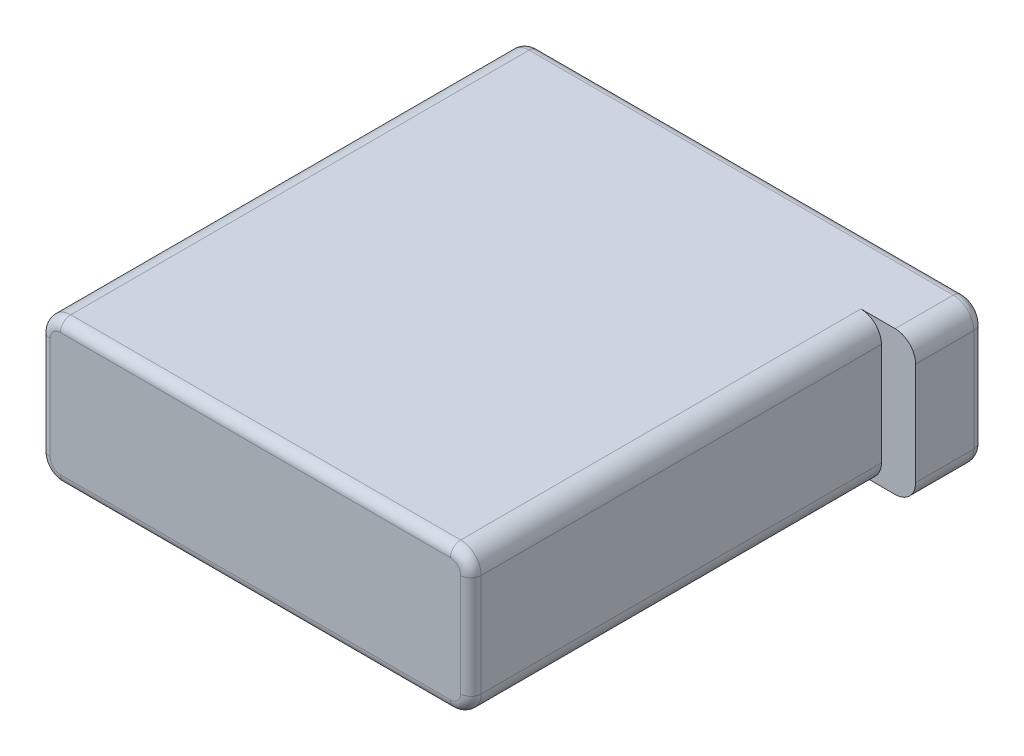
ISO-10303-21;
HEADER;
FILE_DESCRIPTION(('STEP AP214'),'2;1');
FILE_NAME('part.step','',(''),(''),'','','');
FILE_SCHEMA(('AUTOMOTIVE_DESIGN { 1 0 10303 214 1 1 1 1 }'));
ENDSEC;
DATA;
#1=APPLICATION_CONTEXT('core data for automotive mechanical design processes');
#2=APPLICATION_PROTOCOL_DEFINITION('international standard','automotive_design',2000,#1);
#3=PRODUCT_CONTEXT('',#1,'mechanical');
#4=PRODUCT('Part','Part','',(#3));
#5=PRODUCT_RELATED_PRODUCT_CATEGORY('part','',(#4));
#6=PRODUCT_DEFINITION_FORMATION('','',#4);
#7=PRODUCT_DEFINITION_CONTEXT('part definition',#1,'design');
#8=PRODUCT_DEFINITION('design','',#6,#7);
#9=PRODUCT_DEFINITION_SHAPE('','',#8);
#10=(LENGTH_UNIT() NAMED_UNIT(*) SI_UNIT(.MILLI.,.METRE.));
#11=(NAMED_UNIT(*) PLANE_ANGLE_UNIT() SI_UNIT($,.RADIAN.));
#12=(NAMED_UNIT(*) SI_UNIT($,.STERADIAN.) SOLID_ANGLE_UNIT());
#13=UNCERTAINTY_MEASURE_WITH_UNIT(LENGTH_MEASURE(1.E-05),#10,'distance_accuracy_value','');
#14=(GEOMETRIC_REPRESENTATION_CONTEXT(3) GLOBAL_UNCERTAINTY_ASSIGNED_CONTEXT((#13)) GLOBAL_UNIT_ASSIGNED_CONTEXT((#10,
#11,#12)) REPRESENTATION_CONTEXT('',''));
#15=CARTESIAN_POINT('',(0.,0.,0.));
#16=DIRECTION('',(0.,0.,1.));
#17=DIRECTION('',(1.,0.,0.));
#18=AXIS2_PLACEMENT_3D('',#15,#16,#17);
#19=CARTESIAN_POINT('',(-31.5,21.,-35.));
#20=DIRECTION('',(1.,0.,0.));
#21=DIRECTION('',(0.,0.,-1.));
#22=AXIS2_PLACEMENT_3D('',#19,#20,#21);
#23=PLANE('',#22);
#24=DIRECTION('',(0.,0.,1.));
#25=VECTOR('',#24,1.);
#26=CARTESIAN_POINT('',(-31.5,3.,-35.));
#27=LINE('',#26,#25);
#28=CARTESIAN_POINT('',(-31.5,3.,-33.5));
#29=VERTEX_POINT('',#28);
#30=CARTESIAN_POINT('',(-31.5,3.,33.5));
#31=VERTEX_POINT('',#30);
#32=EDGE_CURVE('E414',#29,#31,#27,.T.);
#33=ORIENTED_EDGE('',*,*,#32,.T.);
#34=DIRECTION('',(0.,-1.,0.));
#35=VECTOR('',#34,1.);
#36=CARTESIAN_POINT('',(-31.5,21.,33.5));
#37=LINE('',#36,#35);
#38=CARTESIAN_POINT('',(-31.5,18.,33.5));
#39=VERTEX_POINT('',#38);
#40=EDGE_CURVE('E298',#31,#39,#37,.F.);
#41=ORIENTED_EDGE('',*,*,#40,.T.);
#42=DIRECTION('',(0.,0.,1.));
#43=VECTOR('',#42,1.);
#44=CARTESIAN_POINT('',(-31.5,18.,-35.));
#45=LINE('',#44,#43);
#46=CARTESIAN_POINT('',(-31.5,18.,-33.5));
#47=VERTEX_POINT('',#46);
#48=EDGE_CURVE('E405',#39,#47,#45,.F.);
#49=ORIENTED_EDGE('',*,*,#48,.T.);
#50=DIRECTION('',(0.,-1.,0.));
#51=VECTOR('',#50,1.);
#52=CARTESIAN_POINT('',(-31.5,3.00000000000001,-33.5));
#53=LINE('',#52,#51);
#54=EDGE_CURVE('E295',#47,#29,#53,.T.);
#55=ORIENTED_EDGE('',*,*,#54,.T.);
#56=EDGE_LOOP('',(#33,#41,#49,#55));
#57=FACE_BOUND('',#56,.T.);
#58=ADVANCED_FACE('F47',(#57),#23,.F.);
#59=CARTESIAN_POINT('',(-31.5,21.,35.));
#60=DIRECTION('',(0.,0.,-1.));
#61=DIRECTION('',(-1.,0.,0.));
#62=AXIS2_PLACEMENT_3D('',#59,#60,#61);
#63=PLANE('',#62);
#64=DIRECTION('',(1.,0.,0.));
#65=VECTOR('',#64,1.);
#66=CARTESIAN_POINT('',(-28.5,19.5,35.));
#67=LINE('',#66,#65);
#68=CARTESIAN_POINT('',(28.5,19.5,35.));
#69=VERTEX_POINT('',#68);
#70=CARTESIAN_POINT('',(-28.5,19.5,35.));
#71=VERTEX_POINT('',#70);
#72=EDGE_CURVE('E255',#69,#71,#67,.F.);
#73=ORIENTED_EDGE('',*,*,#72,.T.);
#74=CARTESIAN_POINT('',(-28.5,18.,35.));
#75=DIRECTION('',(0.,0.,-1.));
#76=DIRECTION('',(-1.,0.,0.));
#77=AXIS2_PLACEMENT_3D('',#74,#75,#76);
#78=CIRCLE('',#77,1.5);
#79=CARTESIAN_POINT('',(-30.,18.,35.));
#80=VERTEX_POINT('',#79);
#81=EDGE_CURVE('E258',#71,#80,#78,.F.);
#82=ORIENTED_EDGE('',*,*,#81,.T.);
#83=DIRECTION('',(0.,-1.,0.));
#84=VECTOR('',#83,1.);
#85=CARTESIAN_POINT('',(-30.,21.,35.));
#86=LINE('',#85,#84);
#87=CARTESIAN_POINT('',(-30.,3.,35.));
#88=VERTEX_POINT('',#87);
#89=EDGE_CURVE('E237',#80,#88,#86,.T.);
#90=ORIENTED_EDGE('',*,*,#89,.T.);
#91=CARTESIAN_POINT('',(-28.5,3.,35.));
#92=DIRECTION('',(0.,0.,-1.));
#93=DIRECTION('',(-1.,0.,0.));
#94=AXIS2_PLACEMENT_3D('',#91,#92,#93);
#95=CIRCLE('',#94,1.5);
#96=CARTESIAN_POINT('',(-28.5,1.5,35.));
#97=VERTEX_POINT('',#96);
#98=EDGE_CURVE('E240',#88,#97,#95,.F.);
#99=ORIENTED_EDGE('',*,*,#98,.T.);
#100=DIRECTION('',(1.,0.,0.));
#101=VECTOR('',#100,1.);
#102=CARTESIAN_POINT('',(-31.5,1.5,35.));
#103=LINE('',#102,#101);
#104=CARTESIAN_POINT('',(28.5,1.5,35.));
#105=VERTEX_POINT('',#104);
#106=EDGE_CURVE('E243',#97,#105,#103,.T.);
#107=ORIENTED_EDGE('',*,*,#106,.T.);
#108=CARTESIAN_POINT('',(28.5,3.,35.));
#109=DIRECTION('',(0.,0.,-1.));
#110=DIRECTION('',(-1.,0.,0.));
#111=AXIS2_PLACEMENT_3D('',#108,#109,#110);
#112=CIRCLE('',#111,1.5);
#113=CARTESIAN_POINT('',(30.,3.,35.));
#114=VERTEX_POINT('',#113);
#115=EDGE_CURVE('E246',#105,#114,#112,.F.);
#116=ORIENTED_EDGE('',*,*,#115,.T.);
#117=DIRECTION('',(0.,-1.,0.));
#118=VECTOR('',#117,1.);
#119=CARTESIAN_POINT('',(30.,18.,35.));
#120=LINE('',#119,#118);
#121=CARTESIAN_POINT('',(30.,18.,35.));
#122=VERTEX_POINT('',#121);
#123=EDGE_CURVE('E249',#114,#122,#120,.F.);
#124=ORIENTED_EDGE('',*,*,#123,.T.);
#125=CARTESIAN_POINT('',(28.5,18.,35.));
#126=DIRECTION('',(0.,0.,-1.));
#127=DIRECTION('',(-1.,0.,0.));
#128=AXIS2_PLACEMENT_3D('',#125,#126,#127);
#129=CIRCLE('',#128,1.5);
#130=EDGE_CURVE('E252',#122,#69,#129,.F.);
#131=ORIENTED_EDGE('',*,*,#130,.T.);
#132=EDGE_LOOP('',(#73,#82,#90,#99,#107,#116,#124,#131));
#133=FACE_BOUND('',#132,.T.);
#134=ADVANCED_FACE('F513',(#133),#63,.F.);
#135=CARTESIAN_POINT('',(31.5,21.,-35.));
#136=DIRECTION('',(1.,0.,0.));
#137=DIRECTION('',(0.,0.,-1.));
#138=AXIS2_PLACEMENT_3D('',#135,#136,#137);
#139=PLANE('',#138);
#140=DIRECTION('',(0.,0.,1.));
#141=VECTOR('',#140,1.);
#142=CARTESIAN_POINT('',(31.5,18.,-35.));
#143=LINE('',#142,#141);
#144=CARTESIAN_POINT('',(31.5,18.,-25.));
#145=VERTEX_POINT('',#144);
#146=CARTESIAN_POINT('',(31.5,18.,33.5));
#147=VERTEX_POINT('',#146);
#148=EDGE_CURVE('E219',#145,#147,#143,.T.);
#149=ORIENTED_EDGE('',*,*,#148,.T.);
#150=DIRECTION('',(0.,-1.,0.));
#151=VECTOR('',#150,1.);
#152=CARTESIAN_POINT('',(31.5,3.00000000000001,33.5));
#153=LINE('',#152,#151);
#154=CARTESIAN_POINT('',(31.5,3.,33.5));
#155=VERTEX_POINT('',#154);
#156=EDGE_CURVE('E278',#147,#155,#153,.T.);
#157=ORIENTED_EDGE('',*,*,#156,.T.);
#158=DIRECTION('',(0.,0.,1.));
#159=VECTOR('',#158,1.);
#160=CARTESIAN_POINT('',(31.5,3.,-25.));
#161=LINE('',#160,#159);
#162=CARTESIAN_POINT('',(31.5,3.,-25.));
#163=VERTEX_POINT('',#162);
#164=EDGE_CURVE('E225',#155,#163,#161,.F.);
#165=ORIENTED_EDGE('',*,*,#164,.T.);
#166=DIRECTION('',(0.,-1.,0.));
#167=VECTOR('',#166,1.);
#168=CARTESIAN_POINT('',(31.5,0.,-25.));
#169=LINE('',#168,#167);
#170=EDGE_CURVE('E361',#145,#163,#169,.T.);
#171=ORIENTED_EDGE('',*,*,#170,.F.);
#172=EDGE_LOOP('',(#149,#157,#165,#171));
#173=FACE_BOUND('',#172,.T.);
#174=ADVANCED_FACE('F502',(#173),#139,.T.);
#175=CARTESIAN_POINT('',(-31.5,21.,-35.));
#176=DIRECTION('',(0.,0.,-1.));
#177=DIRECTION('',(-1.,0.,0.));
#178=AXIS2_PLACEMENT_3D('',#175,#176,#177);
#179=PLANE('',#178);
#180=DIRECTION('',(0.,1.,0.));
#181=VECTOR('',#180,1.);
#182=CARTESIAN_POINT('',(35.,21.,-35.));
#183=LINE('',#182,#181);
#184=CARTESIAN_POINT('',(35.,18.,-35.));
#185=VERTEX_POINT('',#184);
#186=CARTESIAN_POINT('',(35.,3.,-35.));
#187=VERTEX_POINT('',#186);
#188=EDGE_CURVE('E319',#185,#187,#183,.F.);
#189=ORIENTED_EDGE('',*,*,#188,.T.);
#190=CARTESIAN_POINT('',(33.5,3.,-35.));
#191=DIRECTION('',(0.,0.,-1.));
#192=DIRECTION('',(-1.,0.,0.));
#193=AXIS2_PLACEMENT_3D('',#190,#191,#192);
#194=CIRCLE('',#193,1.5);
#195=CARTESIAN_POINT('',(33.5,1.5,-35.));
#196=VERTEX_POINT('',#195);
#197=EDGE_CURVE('E322',#187,#196,#194,.T.);
#198=ORIENTED_EDGE('',*,*,#197,.T.);
#199=DIRECTION('',(1.,0.,0.));
#200=VECTOR('',#199,1.);
#201=CARTESIAN_POINT('',(-28.5,1.5,-35.));
#202=LINE('',#201,#200);
#203=CARTESIAN_POINT('',(-28.5,1.5,-35.));
#204=VERTEX_POINT('',#203);
#205=EDGE_CURVE('E301',#196,#204,#202,.F.);
#206=ORIENTED_EDGE('',*,*,#205,.T.);
#207=CARTESIAN_POINT('',(-28.5,3.,-35.));
#208=DIRECTION('',(0.,0.,-1.));
#209=DIRECTION('',(-1.,0.,0.));
#210=AXIS2_PLACEMENT_3D('',#207,#208,#209);
#211=CIRCLE('',#210,1.5);
#212=CARTESIAN_POINT('',(-30.,3.,-35.));
#213=VERTEX_POINT('',#212);
#214=EDGE_CURVE('E304',#204,#213,#211,.T.);
#215=ORIENTED_EDGE('',*,*,#214,.T.);
#216=DIRECTION('',(0.,-1.,0.));
#217=VECTOR('',#216,1.);
#218=CARTESIAN_POINT('',(-30.,18.,-35.));
#219=LINE('',#218,#217);
#220=CARTESIAN_POINT('',(-30.,18.,-35.));
#221=VERTEX_POINT('',#220);
#222=EDGE_CURVE('E307',#213,#221,#219,.F.);
#223=ORIENTED_EDGE('',*,*,#222,.T.);
#224=CARTESIAN_POINT('',(-28.5,18.,-35.));
#225=DIRECTION('',(0.,0.,-1.));
#226=DIRECTION('',(-1.,0.,0.));
#227=AXIS2_PLACEMENT_3D('',#224,#225,#226);
#228=CIRCLE('',#227,1.5);
#229=CARTESIAN_POINT('',(-28.5,19.5,-35.));
#230=VERTEX_POINT('',#229);
#231=EDGE_CURVE('E310',#221,#230,#228,.T.);
#232=ORIENTED_EDGE('',*,*,#231,.T.);
#233=DIRECTION('',(1.,0.,0.));
#234=VECTOR('',#233,1.);
#235=CARTESIAN_POINT('',(-31.5,19.5,-35.));
#236=LINE('',#235,#234);
#237=CARTESIAN_POINT('',(33.5,19.5,-35.));
#238=VERTEX_POINT('',#237);
#239=EDGE_CURVE('E313',#230,#238,#236,.T.);
#240=ORIENTED_EDGE('',*,*,#239,.T.);
#241=CARTESIAN_POINT('',(33.5,18.,-35.));
#242=DIRECTION('',(0.,0.,-1.));
#243=DIRECTION('',(-1.,0.,0.));
#244=AXIS2_PLACEMENT_3D('',#241,#242,#243);
#245=CIRCLE('',#244,1.5);
#246=EDGE_CURVE('E316',#238,#185,#245,.T.);
#247=ORIENTED_EDGE('',*,*,#246,.T.);
#248=EDGE_LOOP('',(#189,#198,#206,#215,#223,#232,#240,#247));
#249=FACE_BOUND('',#248,.T.);
#250=ADVANCED_FACE('F482',(#249),#179,.T.);
#251=CARTESIAN_POINT('',(0.,21.,0.));
#252=DIRECTION('',(0.,1.,0.));
#253=DIRECTION('',(0.,0.,1.));
#254=AXIS2_PLACEMENT_3D('',#251,#252,#253);
#255=PLANE('',#254);
#256=DIRECTION('',(0.,0.,1.));
#257=VECTOR('',#256,1.);
#258=CARTESIAN_POINT('',(-28.5,21.,35.));
#259=LINE('',#258,#257);
#260=CARTESIAN_POINT('',(-28.5,21.,-33.5));
#261=VERTEX_POINT('',#260);
#262=CARTESIAN_POINT('',(-28.5,21.,33.5));
#263=VERTEX_POINT('',#262);
#264=EDGE_CURVE('E408',#261,#263,#259,.T.);
#265=ORIENTED_EDGE('',*,*,#264,.T.);
#266=DIRECTION('',(1.,0.,0.));
#267=VECTOR('',#266,1.);
#268=CARTESIAN_POINT('',(28.5,21.,33.5));
#269=LINE('',#268,#267);
#270=CARTESIAN_POINT('',(28.5,21.,33.5));
#271=VERTEX_POINT('',#270);
#272=EDGE_CURVE('E272',#263,#271,#269,.T.);
#273=ORIENTED_EDGE('',*,*,#272,.T.);
#274=DIRECTION('',(0.,0.,1.));
#275=VECTOR('',#274,1.);
#276=CARTESIAN_POINT('',(28.5,21.,0.));
#277=LINE('',#276,#275);
#278=CARTESIAN_POINT('',(28.5,21.,-25.));
#279=VERTEX_POINT('',#278);
#280=EDGE_CURVE('E426',#271,#279,#277,.F.);
#281=ORIENTED_EDGE('',*,*,#280,.T.);
#282=DIRECTION('',(-1.,0.,0.));
#283=VECTOR('',#282,1.);
#284=CARTESIAN_POINT('',(36.5,21.,-25.));
#285=LINE('',#284,#283);
#286=CARTESIAN_POINT('',(33.5,21.,-25.));
#287=VERTEX_POINT('',#286);
#288=EDGE_CURVE('E212',#287,#279,#285,.T.);
#289=ORIENTED_EDGE('',*,*,#288,.F.);
#290=DIRECTION('',(0.,0.,1.));
#291=VECTOR('',#290,1.);
#292=CARTESIAN_POINT('',(33.5,21.,0.));
#293=LINE('',#292,#291);
#294=CARTESIAN_POINT('',(33.5,21.,-33.5));
#295=VERTEX_POINT('',#294);
#296=EDGE_CURVE('E429',#287,#295,#293,.F.);
#297=ORIENTED_EDGE('',*,*,#296,.T.);
#298=DIRECTION('',(1.,0.,0.));
#299=VECTOR('',#298,1.);
#300=CARTESIAN_POINT('',(0.,21.,-33.5));
#301=LINE('',#300,#299);
#302=EDGE_CURVE('E269',#295,#261,#301,.F.);
#303=ORIENTED_EDGE('',*,*,#302,.T.);
#304=EDGE_LOOP('',(#265,#273,#281,#289,#297,#303));
#305=FACE_BOUND('',#304,.T.);
#306=ADVANCED_FACE('F496',(#305),#255,.T.);
#307=CARTESIAN_POINT('',(0.,0.,0.));
#308=DIRECTION('',(0.,1.,0.));
#309=DIRECTION('',(0.,0.,1.));
#310=AXIS2_PLACEMENT_3D('',#307,#308,#309);
#311=PLANE('',#310);
#312=DIRECTION('',(0.,0.,1.));
#313=VECTOR('',#312,1.);
#314=CARTESIAN_POINT('',(28.5,0.,35.));
#315=LINE('',#314,#313);
#316=CARTESIAN_POINT('',(28.5,0.,-25.));
#317=VERTEX_POINT('',#316);
#318=CARTESIAN_POINT('',(28.5,0.,33.5));
#319=VERTEX_POINT('',#318);
#320=EDGE_CURVE('E200',#317,#319,#315,.T.);
#321=ORIENTED_EDGE('',*,*,#320,.T.);
#322=DIRECTION('',(1.,0.,0.));
#323=VECTOR('',#322,1.);
#324=CARTESIAN_POINT('',(0.,0.,33.5));
#325=LINE('',#324,#323);
#326=CARTESIAN_POINT('',(-28.5,0.,33.5));
#327=VERTEX_POINT('',#326);
#328=EDGE_CURVE('E286',#319,#327,#325,.F.);
#329=ORIENTED_EDGE('',*,*,#328,.T.);
#330=DIRECTION('',(0.,0.,1.));
#331=VECTOR('',#330,1.);
#332=CARTESIAN_POINT('',(-28.5,0.,0.));
#333=LINE('',#332,#331);
#334=CARTESIAN_POINT('',(-28.5,0.,-33.5));
#335=VERTEX_POINT('',#334);
#336=EDGE_CURVE('E199',#327,#335,#333,.F.);
#337=ORIENTED_EDGE('',*,*,#336,.T.);
#338=DIRECTION('',(1.,0.,0.));
#339=VECTOR('',#338,1.);
#340=CARTESIAN_POINT('',(33.5,0.,-33.5));
#341=LINE('',#340,#339);
#342=CARTESIAN_POINT('',(33.5,0.,-33.5));
#343=VERTEX_POINT('',#342);
#344=EDGE_CURVE('E194',#335,#343,#341,.T.);
#345=ORIENTED_EDGE('',*,*,#344,.T.);
#346=DIRECTION('',(0.,0.,-1.));
#347=VECTOR('',#346,1.);
#348=CARTESIAN_POINT('',(33.5,0.,-25.));
#349=LINE('',#348,#347);
#350=CARTESIAN_POINT('',(33.5,0.,-25.));
#351=VERTEX_POINT('',#350);
#352=EDGE_CURVE('E186',#343,#351,#349,.F.);
#353=ORIENTED_EDGE('',*,*,#352,.T.);
#354=DIRECTION('',(-1.,0.,0.));
#355=VECTOR('',#354,1.);
#356=CARTESIAN_POINT('',(36.5,0.,-25.));
#357=LINE('',#356,#355);
#358=EDGE_CURVE('E190',#351,#317,#357,.T.);
#359=ORIENTED_EDGE('',*,*,#358,.T.);
#360=EDGE_LOOP('',(#321,#329,#337,#345,#353,#359));
#361=FACE_BOUND('',#360,.T.);
#362=ADVANCED_FACE('F189',(#361),#311,.F.);
#363=CARTESIAN_POINT('',(36.5,0.,-25.));
#364=DIRECTION('',(0.,0.,-1.));
#365=DIRECTION('',(-1.,0.,0.));
#366=AXIS2_PLACEMENT_3D('',#363,#364,#365);
#367=PLANE('',#366);
#368=ORIENTED_EDGE('',*,*,#358,.F.);
#369=CARTESIAN_POINT('',(33.5,3.,-25.));
#370=DIRECTION('',(0.,0.,-1.));
#371=DIRECTION('',(-1.,0.,0.));
#372=AXIS2_PLACEMENT_3D('',#369,#370,#371);
#373=CIRCLE('',#372,3.);
#374=CARTESIAN_POINT('',(36.5,3.,-25.));
#375=VERTEX_POINT('',#374);
#376=EDGE_CURVE('E205',#351,#375,#373,.F.);
#377=ORIENTED_EDGE('',*,*,#376,.T.);
#378=DIRECTION('',(0.,-1.,0.));
#379=VECTOR('',#378,1.);
#380=CARTESIAN_POINT('',(36.5,0.,-25.));
#381=LINE('',#380,#379);
#382=CARTESIAN_POINT('',(36.5,18.,-25.));
#383=VERTEX_POINT('',#382);
#384=EDGE_CURVE('E213',#383,#375,#381,.T.);
#385=ORIENTED_EDGE('',*,*,#384,.F.);
#386=CARTESIAN_POINT('',(33.5,18.,-25.));
#387=DIRECTION('',(0.,0.,-1.));
#388=DIRECTION('',(-1.,0.,0.));
#389=AXIS2_PLACEMENT_3D('',#386,#387,#388);
#390=CIRCLE('',#389,3.);
#391=EDGE_CURVE('E220',#383,#287,#390,.F.);
#392=ORIENTED_EDGE('',*,*,#391,.T.);
#393=ORIENTED_EDGE('',*,*,#288,.T.);
#394=CARTESIAN_POINT('',(28.5,18.,-25.));
#395=DIRECTION('',(0.,0.,-1.));
#396=DIRECTION('',(-1.,0.,0.));
#397=AXIS2_PLACEMENT_3D('',#394,#395,#396);
#398=CIRCLE('',#397,3.);
#399=EDGE_CURVE('E234',#279,#145,#398,.T.);
#400=ORIENTED_EDGE('',*,*,#399,.T.);
#401=ORIENTED_EDGE('',*,*,#170,.T.);
#402=CARTESIAN_POINT('',(28.5,3.,-25.));
#403=DIRECTION('',(0.,0.,-1.));
#404=DIRECTION('',(-1.,0.,0.));
#405=AXIS2_PLACEMENT_3D('',#402,#403,#404);
#406=CIRCLE('',#405,3.);
#407=EDGE_CURVE('E209',#163,#317,#406,.T.);
#408=ORIENTED_EDGE('',*,*,#407,.T.);
#409=EDGE_LOOP('',(#368,#377,#385,#392,#393,#400,#401,#408));
#410=FACE_BOUND('',#409,.T.);
#411=ADVANCED_FACE('F203',(#410),#367,.F.);
#412=CARTESIAN_POINT('',(36.5,0.,0.));
#413=DIRECTION('',(1.,0.,0.));
#414=DIRECTION('',(0.,0.,-1.));
#415=AXIS2_PLACEMENT_3D('',#412,#413,#414);
#416=PLANE('',#415);
#417=DIRECTION('',(0.,0.,-1.));
#418=VECTOR('',#417,1.);
#419=CARTESIAN_POINT('',(36.5,3.,-35.));
#420=LINE('',#419,#418);
#421=CARTESIAN_POINT('',(36.5,3.,-33.5));
#422=VERTEX_POINT('',#421);
#423=EDGE_CURVE('E217',#375,#422,#420,.T.);
#424=ORIENTED_EDGE('',*,*,#423,.T.);
#425=DIRECTION('',(0.,1.,0.));
#426=VECTOR('',#425,1.);
#427=CARTESIAN_POINT('',(36.5,0.,-33.5));
#428=LINE('',#427,#426);
#429=CARTESIAN_POINT('',(36.5,18.,-33.5));
#430=VERTEX_POINT('',#429);
#431=EDGE_CURVE('E57',#422,#430,#428,.T.);
#432=ORIENTED_EDGE('',*,*,#431,.T.);
#433=DIRECTION('',(0.,0.,1.));
#434=VECTOR('',#433,1.);
#435=CARTESIAN_POINT('',(36.5,18.,0.));
#436=LINE('',#435,#434);
#437=EDGE_CURVE('E435',#430,#383,#436,.T.);
#438=ORIENTED_EDGE('',*,*,#437,.T.);
#439=ORIENTED_EDGE('',*,*,#384,.T.);
#440=EDGE_LOOP('',(#424,#432,#438,#439));
#441=FACE_BOUND('',#440,.T.);
#442=ADVANCED_FACE('F438',(#441),#416,.T.);
#443=CARTESIAN_POINT('',(-28.5,3.,-35.));
#444=DIRECTION('',(0.,0.,1.));
#445=DIRECTION('',(1.,0.,0.));
#446=AXIS2_PLACEMENT_3D('',#443,#444,#445);
#447=CYLINDRICAL_SURFACE('',#446,3.);
#448=ORIENTED_EDGE('',*,*,#336,.F.);
#449=CARTESIAN_POINT('',(-28.5,3.,33.5));
#450=DIRECTION('',(0.,0.,-1.));
#451=DIRECTION('',(-1.,0.,0.));
#452=AXIS2_PLACEMENT_3D('',#449,#450,#451);
#453=CIRCLE('',#452,3.);
#454=EDGE_CURVE('E292',#327,#31,#453,.T.);
#455=ORIENTED_EDGE('',*,*,#454,.T.);
#456=ORIENTED_EDGE('',*,*,#32,.F.);
#457=CARTESIAN_POINT('',(-28.5,3.,-33.5));
#458=DIRECTION('',(0.,0.,-1.));
#459=DIRECTION('',(-1.,0.,0.));
#460=AXIS2_PLACEMENT_3D('',#457,#458,#459);
#461=CIRCLE('',#460,3.);
#462=EDGE_CURVE('E289',#29,#335,#461,.F.);
#463=ORIENTED_EDGE('',*,*,#462,.T.);
#464=EDGE_LOOP('',(#448,#455,#456,#463));
#465=FACE_BOUND('',#464,.T.);
#466=ADVANCED_FACE('F469',(#465),#447,.T.);
#467=CARTESIAN_POINT('',(-28.5,18.,0.));
#468=DIRECTION('',(0.,0.,-1.));
#469=DIRECTION('',(-1.,0.,0.));
#470=AXIS2_PLACEMENT_3D('',#467,#468,#469);
#471=CYLINDRICAL_SURFACE('',#470,3.);
#472=ORIENTED_EDGE('',*,*,#48,.F.);
#473=CARTESIAN_POINT('',(-28.5,18.,33.5));
#474=DIRECTION('',(0.,0.,-1.));
#475=DIRECTION('',(-1.,0.,0.));
#476=AXIS2_PLACEMENT_3D('',#473,#474,#475);
#477=CIRCLE('',#476,3.);
#478=EDGE_CURVE('E265',#39,#263,#477,.T.);
#479=ORIENTED_EDGE('',*,*,#478,.T.);
#480=ORIENTED_EDGE('',*,*,#264,.F.);
#481=CARTESIAN_POINT('',(-28.5,18.,-33.5));
#482=DIRECTION('',(0.,0.,-1.));
#483=DIRECTION('',(-1.,0.,0.));
#484=AXIS2_PLACEMENT_3D('',#481,#482,#483);
#485=CIRCLE('',#484,3.);
#486=EDGE_CURVE('E262',#261,#47,#485,.F.);
#487=ORIENTED_EDGE('',*,*,#486,.T.);
#488=EDGE_LOOP('',(#472,#479,#480,#487));
#489=FACE_BOUND('',#488,.T.);
#490=ADVANCED_FACE('F404',(#489),#471,.T.);
#491=CARTESIAN_POINT('',(33.5,3.,0.));
#492=DIRECTION('',(0.,0.,1.));
#493=DIRECTION('',(1.,0.,0.));
#494=AXIS2_PLACEMENT_3D('',#491,#492,#493);
#495=CYLINDRICAL_SURFACE('',#494,3.);
#496=ORIENTED_EDGE('',*,*,#352,.F.);
#497=CARTESIAN_POINT('',(33.5,3.,-33.5));
#498=DIRECTION('',(0.,0.,-1.));
#499=DIRECTION('',(-1.,0.,0.));
#500=AXIS2_PLACEMENT_3D('',#497,#498,#499);
#501=CIRCLE('',#500,3.);
#502=EDGE_CURVE('E326',#343,#422,#501,.F.);
#503=ORIENTED_EDGE('',*,*,#502,.T.);
#504=ORIENTED_EDGE('',*,*,#423,.F.);
#505=ORIENTED_EDGE('',*,*,#376,.F.);
#506=EDGE_LOOP('',(#496,#503,#504,#505));
#507=FACE_BOUND('',#506,.T.);
#508=ADVANCED_FACE('F216',(#507),#495,.T.);
#509=CARTESIAN_POINT('',(33.5,18.,0.));
#510=DIRECTION('',(0.,0.,1.));
#511=DIRECTION('',(1.,0.,0.));
#512=AXIS2_PLACEMENT_3D('',#509,#510,#511);
#513=CYLINDRICAL_SURFACE('',#512,3.);
#514=ORIENTED_EDGE('',*,*,#437,.F.);
#515=CARTESIAN_POINT('',(33.5,18.,-33.5));
#516=DIRECTION('',(0.,0.,-1.));
#517=DIRECTION('',(-1.,0.,0.));
#518=AXIS2_PLACEMENT_3D('',#515,#516,#517);
#519=CIRCLE('',#518,3.);
#520=EDGE_CURVE('E11',#430,#295,#519,.F.);
#521=ORIENTED_EDGE('',*,*,#520,.T.);
#522=ORIENTED_EDGE('',*,*,#296,.F.);
#523=ORIENTED_EDGE('',*,*,#391,.F.);
#524=EDGE_LOOP('',(#514,#521,#522,#523));
#525=FACE_BOUND('',#524,.T.);
#526=ADVANCED_FACE('F493',(#525),#513,.T.);
#527=CARTESIAN_POINT('',(28.5,3.,0.));
#528=DIRECTION('',(0.,0.,-1.));
#529=DIRECTION('',(-1.,0.,0.));
#530=AXIS2_PLACEMENT_3D('',#527,#528,#529);
#531=CYLINDRICAL_SURFACE('',#530,3.);
#532=ORIENTED_EDGE('',*,*,#164,.F.);
#533=CARTESIAN_POINT('',(28.5,3.,33.5));
#534=DIRECTION('',(0.,0.,-1.));
#535=DIRECTION('',(-1.,0.,0.));
#536=AXIS2_PLACEMENT_3D('',#533,#534,#535);
#537=CIRCLE('',#536,3.);
#538=EDGE_CURVE('E281',#155,#319,#537,.T.);
#539=ORIENTED_EDGE('',*,*,#538,.T.);
#540=ORIENTED_EDGE('',*,*,#320,.F.);
#541=ORIENTED_EDGE('',*,*,#407,.F.);
#542=EDGE_LOOP('',(#532,#539,#540,#541));
#543=FACE_BOUND('',#542,.T.);
#544=ADVANCED_FACE('F450',(#543),#531,.T.);
#545=CARTESIAN_POINT('',(28.5,18.,-35.));
#546=DIRECTION('',(0.,0.,1.));
#547=DIRECTION('',(1.,0.,0.));
#548=AXIS2_PLACEMENT_3D('',#545,#546,#547);
#549=CYLINDRICAL_SURFACE('',#548,3.);
#550=ORIENTED_EDGE('',*,*,#280,.F.);
#551=CARTESIAN_POINT('',(28.5,18.,33.5));
#552=DIRECTION('',(0.,0.,-1.));
#553=DIRECTION('',(-1.,0.,0.));
#554=AXIS2_PLACEMENT_3D('',#551,#552,#553);
#555=CIRCLE('',#554,3.);
#556=EDGE_CURVE('E275',#271,#147,#555,.T.);
#557=ORIENTED_EDGE('',*,*,#556,.T.);
#558=ORIENTED_EDGE('',*,*,#148,.F.);
#559=ORIENTED_EDGE('',*,*,#399,.F.);
#560=EDGE_LOOP('',(#550,#557,#558,#559));
#561=FACE_BOUND('',#560,.T.);
#562=ADVANCED_FACE('F499',(#561),#549,.T.);
#563=CARTESIAN_POINT('',(28.5,3.,33.5));
#564=DIRECTION('',(0.,0.,-1.));
#565=DIRECTION('',(-1.,0.,0.));
#566=AXIS2_PLACEMENT_3D('',#563,#564,#565);
#567=DEGENERATE_TOROIDAL_SURFACE('',#566,1.5,1.5,.T.);
#568=CARTESIAN_POINT('',(28.5,1.5,33.5));
#569=DIRECTION('',(-1.,0.,0.));
#570=DIRECTION('',(0.,0.,1.));
#571=AXIS2_PLACEMENT_3D('',#568,#569,#570);
#572=CIRCLE('',#571,1.5);
#573=EDGE_CURVE('E353',#319,#105,#572,.T.);
#574=ORIENTED_EDGE('',*,*,#573,.F.);
#575=ORIENTED_EDGE('',*,*,#538,.F.);
#576=CARTESIAN_POINT('',(30.,3.,33.5));
#577=DIRECTION('',(0.,1.,0.));
#578=DIRECTION('',(0.,0.,1.));
#579=AXIS2_PLACEMENT_3D('',#576,#577,#578);
#580=CIRCLE('',#579,1.5);
#581=EDGE_CURVE('E357',#114,#155,#580,.T.);
#582=ORIENTED_EDGE('',*,*,#581,.F.);
#583=ORIENTED_EDGE('',*,*,#115,.F.);
#584=EDGE_LOOP('',(#574,#575,#582,#583));
#585=FACE_BOUND('',#584,.T.);
#586=ADVANCED_FACE('F457',(#585),#567,.T.);
#587=CARTESIAN_POINT('',(30.,21.,33.5));
#588=DIRECTION('',(0.,1.,0.));
#589=DIRECTION('',(0.,0.,1.));
#590=AXIS2_PLACEMENT_3D('',#587,#588,#589);
#591=CYLINDRICAL_SURFACE('',#590,1.5);
#592=ORIENTED_EDGE('',*,*,#581,.T.);
#593=ORIENTED_EDGE('',*,*,#156,.F.);
#594=CARTESIAN_POINT('',(30.,18.,33.5));
#595=DIRECTION('',(0.,1.,0.));
#596=DIRECTION('',(0.,0.,1.));
#597=AXIS2_PLACEMENT_3D('',#594,#595,#596);
#598=CIRCLE('',#597,1.5);
#599=EDGE_CURVE('E349',#122,#147,#598,.T.);
#600=ORIENTED_EDGE('',*,*,#599,.F.);
#601=ORIENTED_EDGE('',*,*,#123,.F.);
#602=EDGE_LOOP('',(#592,#593,#600,#601));
#603=FACE_BOUND('',#602,.T.);
#604=ADVANCED_FACE('F505',(#603),#591,.T.);
#605=CARTESIAN_POINT('',(-31.5,1.5,33.5));
#606=DIRECTION('',(1.,0.,0.));
#607=DIRECTION('',(0.,0.,-1.));
#608=AXIS2_PLACEMENT_3D('',#605,#606,#607);
#609=CYLINDRICAL_SURFACE('',#608,1.5);
#610=ORIENTED_EDGE('',*,*,#573,.T.);
#611=ORIENTED_EDGE('',*,*,#106,.F.);
#612=CARTESIAN_POINT('',(-28.5,1.5,33.5));
#613=DIRECTION('',(-1.,0.,0.));
#614=DIRECTION('',(0.,0.,1.));
#615=AXIS2_PLACEMENT_3D('',#612,#613,#614);
#616=CIRCLE('',#615,1.5);
#617=EDGE_CURVE('E345',#327,#97,#616,.T.);
#618=ORIENTED_EDGE('',*,*,#617,.F.);
#619=ORIENTED_EDGE('',*,*,#328,.F.);
#620=EDGE_LOOP('',(#610,#611,#618,#619));
#621=FACE_BOUND('',#620,.T.);
#622=ADVANCED_FACE('F462',(#621),#609,.T.);
#623=CARTESIAN_POINT('',(28.5,18.,33.5));
#624=DIRECTION('',(0.,0.,-1.));
#625=DIRECTION('',(-1.,0.,0.));
#626=AXIS2_PLACEMENT_3D('',#623,#624,#625);
#627=DEGENERATE_TOROIDAL_SURFACE('',#626,1.5,1.5,.T.);
#628=ORIENTED_EDGE('',*,*,#599,.T.);
#629=ORIENTED_EDGE('',*,*,#556,.F.);
#630=CARTESIAN_POINT('',(28.5,19.5,33.5));
#631=DIRECTION('',(-1.,0.,0.));
#632=DIRECTION('',(0.,0.,1.));
#633=AXIS2_PLACEMENT_3D('',#630,#631,#632);
#634=CIRCLE('',#633,1.5);
#635=EDGE_CURVE('E341',#69,#271,#634,.T.);
#636=ORIENTED_EDGE('',*,*,#635,.F.);
#637=ORIENTED_EDGE('',*,*,#130,.F.);
#638=EDGE_LOOP('',(#628,#629,#636,#637));
#639=FACE_BOUND('',#638,.T.);
#640=ADVANCED_FACE('F509',(#639),#627,.T.);
#641=CARTESIAN_POINT('',(-28.5,3.,33.5));
#642=DIRECTION('',(0.,0.,-1.));
#643=DIRECTION('',(-1.,0.,0.));
#644=AXIS2_PLACEMENT_3D('',#641,#642,#643);
#645=DEGENERATE_TOROIDAL_SURFACE('',#644,1.5,1.5,.T.);
#646=ORIENTED_EDGE('',*,*,#617,.T.);
#647=ORIENTED_EDGE('',*,*,#98,.F.);
#648=CARTESIAN_POINT('',(-30.,3.,33.5));
#649=DIRECTION('',(0.,1.,0.));
#650=DIRECTION('',(0.,0.,1.));
#651=AXIS2_PLACEMENT_3D('',#648,#649,#650);
#652=CIRCLE('',#651,1.5);
#653=EDGE_CURVE('E337',#31,#88,#652,.T.);
#654=ORIENTED_EDGE('',*,*,#653,.F.);
#655=ORIENTED_EDGE('',*,*,#454,.F.);
#656=EDGE_LOOP('',(#646,#647,#654,#655));
#657=FACE_BOUND('',#656,.T.);
#658=ADVANCED_FACE('F467',(#657),#645,.T.);
#659=CARTESIAN_POINT('',(0.,19.5,33.5));
#660=DIRECTION('',(-1.,0.,0.));
#661=DIRECTION('',(0.,0.,1.));
#662=AXIS2_PLACEMENT_3D('',#659,#660,#661);
#663=CYLINDRICAL_SURFACE('',#662,1.5);
#664=ORIENTED_EDGE('',*,*,#635,.T.);
#665=ORIENTED_EDGE('',*,*,#272,.F.);
#666=CARTESIAN_POINT('',(-28.5,19.5,33.5));
#667=DIRECTION('',(-1.,0.,0.));
#668=DIRECTION('',(0.,0.,1.));
#669=AXIS2_PLACEMENT_3D('',#666,#667,#668);
#670=CIRCLE('',#669,1.5);
#671=EDGE_CURVE('E334',#71,#263,#670,.T.);
#672=ORIENTED_EDGE('',*,*,#671,.F.);
#673=ORIENTED_EDGE('',*,*,#72,.F.);
#674=EDGE_LOOP('',(#664,#665,#672,#673));
#675=FACE_BOUND('',#674,.T.);
#676=ADVANCED_FACE('F524',(#675),#663,.T.);
#677=CARTESIAN_POINT('',(-30.,21.,33.5));
#678=DIRECTION('',(0.,-1.,0.));
#679=DIRECTION('',(0.,0.,-1.));
#680=AXIS2_PLACEMENT_3D('',#677,#678,#679);
#681=CYLINDRICAL_SURFACE('',#680,1.5);
#682=ORIENTED_EDGE('',*,*,#653,.T.);
#683=ORIENTED_EDGE('',*,*,#89,.F.);
#684=CARTESIAN_POINT('',(-30.,18.,33.5));
#685=DIRECTION('',(0.,1.,0.));
#686=DIRECTION('',(0.,0.,1.));
#687=AXIS2_PLACEMENT_3D('',#684,#685,#686);
#688=CIRCLE('',#687,1.5);
#689=EDGE_CURVE('E331',#39,#80,#688,.T.);
#690=ORIENTED_EDGE('',*,*,#689,.F.);
#691=ORIENTED_EDGE('',*,*,#40,.F.);
#692=EDGE_LOOP('',(#682,#683,#690,#691));
#693=FACE_BOUND('',#692,.T.);
#694=ADVANCED_FACE('F517',(#693),#681,.T.);
#695=CARTESIAN_POINT('',(-28.5,18.,33.5));
#696=DIRECTION('',(0.,0.,-1.));
#697=DIRECTION('',(-1.,0.,0.));
#698=AXIS2_PLACEMENT_3D('',#695,#696,#697);
#699=DEGENERATE_TOROIDAL_SURFACE('',#698,1.5,1.5,.T.);
#700=ORIENTED_EDGE('',*,*,#671,.T.);
#701=ORIENTED_EDGE('',*,*,#478,.F.);
#702=ORIENTED_EDGE('',*,*,#689,.T.);
#703=ORIENTED_EDGE('',*,*,#81,.F.);
#704=EDGE_LOOP('',(#700,#701,#702,#703));
#705=FACE_BOUND('',#704,.T.);
#706=ADVANCED_FACE('F521',(#705),#699,.T.);
#707=CARTESIAN_POINT('',(-28.5,18.,-33.5));
#708=DIRECTION('',(0.,0.,-1.));
#709=DIRECTION('',(-1.,0.,0.));
#710=AXIS2_PLACEMENT_3D('',#707,#708,#709);
#711=DEGENERATE_TOROIDAL_SURFACE('',#710,1.5,1.5,.T.);
#712=CARTESIAN_POINT('',(-30.,18.,-33.5));
#713=DIRECTION('',(0.,-1.,0.));
#714=DIRECTION('',(0.,0.,-1.));
#715=AXIS2_PLACEMENT_3D('',#712,#713,#714);
#716=CIRCLE('',#715,1.5);
#717=EDGE_CURVE('E382',#47,#221,#716,.T.);
#718=ORIENTED_EDGE('',*,*,#717,.F.);
#719=ORIENTED_EDGE('',*,*,#486,.F.);
#720=CARTESIAN_POINT('',(-28.5,19.5,-33.5));
#721=DIRECTION('',(1.,0.,0.));
#722=DIRECTION('',(0.,0.,-1.));
#723=AXIS2_PLACEMENT_3D('',#720,#721,#722);
#724=CIRCLE('',#723,1.5);
#725=EDGE_CURVE('E51',#230,#261,#724,.T.);
#726=ORIENTED_EDGE('',*,*,#725,.F.);
#727=ORIENTED_EDGE('',*,*,#231,.F.);
#728=EDGE_LOOP('',(#718,#719,#726,#727));
#729=FACE_BOUND('',#728,.T.);
#730=ADVANCED_FACE('F49',(#729),#711,.T.);
#731=CARTESIAN_POINT('',(-31.5,19.5,-33.5));
#732=DIRECTION('',(1.,0.,0.));
#733=DIRECTION('',(0.,0.,-1.));
#734=AXIS2_PLACEMENT_3D('',#731,#732,#733);
#735=CYLINDRICAL_SURFACE('',#734,1.5);
#736=ORIENTED_EDGE('',*,*,#725,.T.);
#737=ORIENTED_EDGE('',*,*,#302,.F.);
#738=CARTESIAN_POINT('',(33.5,19.5,-33.5));
#739=DIRECTION('',(1.,0.,0.));
#740=DIRECTION('',(0.,0.,-1.));
#741=AXIS2_PLACEMENT_3D('',#738,#739,#740);
#742=CIRCLE('',#741,1.5);
#743=EDGE_CURVE('E379',#238,#295,#742,.T.);
#744=ORIENTED_EDGE('',*,*,#743,.F.);
#745=ORIENTED_EDGE('',*,*,#239,.F.);
#746=EDGE_LOOP('',(#736,#737,#744,#745));
#747=FACE_BOUND('',#746,.T.);
#748=ADVANCED_FACE('F395',(#747),#735,.T.);
#749=CARTESIAN_POINT('',(-30.,21.,-33.5));
#750=DIRECTION('',(0.,1.,0.));
#751=DIRECTION('',(0.,0.,1.));
#752=AXIS2_PLACEMENT_3D('',#749,#750,#751);
#753=CYLINDRICAL_SURFACE('',#752,1.5);
#754=ORIENTED_EDGE('',*,*,#717,.T.);
#755=ORIENTED_EDGE('',*,*,#222,.F.);
#756=CARTESIAN_POINT('',(-30.,3.,-33.5));
#757=DIRECTION('',(0.,-1.,0.));
#758=DIRECTION('',(0.,0.,-1.));
#759=AXIS2_PLACEMENT_3D('',#756,#757,#758);
#760=CIRCLE('',#759,1.5);
#761=EDGE_CURVE('E375',#29,#213,#760,.T.);
#762=ORIENTED_EDGE('',*,*,#761,.F.);
#763=ORIENTED_EDGE('',*,*,#54,.F.);
#764=EDGE_LOOP('',(#754,#755,#762,#763));
#765=FACE_BOUND('',#764,.T.);
#766=ADVANCED_FACE('F561',(#765),#753,.T.);
#767=CARTESIAN_POINT('',(33.5,18.,-33.5));
#768=DIRECTION('',(0.,0.,-1.));
#769=DIRECTION('',(-1.,0.,0.));
#770=AXIS2_PLACEMENT_3D('',#767,#768,#769);
#771=DEGENERATE_TOROIDAL_SURFACE('',#770,1.5,1.5,.T.);
#772=ORIENTED_EDGE('',*,*,#743,.T.);
#773=ORIENTED_EDGE('',*,*,#520,.F.);
#774=CARTESIAN_POINT('',(35.,18.,-33.5));
#775=DIRECTION('',(0.,-1.,0.));
#776=DIRECTION('',(0.,0.,-1.));
#777=AXIS2_PLACEMENT_3D('',#774,#775,#776);
#778=CIRCLE('',#777,1.5);
#779=EDGE_CURVE('E371',#185,#430,#778,.T.);
#780=ORIENTED_EDGE('',*,*,#779,.F.);
#781=ORIENTED_EDGE('',*,*,#246,.F.);
#782=EDGE_LOOP('',(#772,#773,#780,#781));
#783=FACE_BOUND('',#782,.T.);
#784=ADVANCED_FACE('F490',(#783),#771,.T.);
#785=CARTESIAN_POINT('',(-28.5,3.,-33.5));
#786=DIRECTION('',(0.,0.,-1.));
#787=DIRECTION('',(-1.,0.,0.));
#788=AXIS2_PLACEMENT_3D('',#785,#786,#787);
#789=DEGENERATE_TOROIDAL_SURFACE('',#788,1.5,1.5,.T.);
#790=ORIENTED_EDGE('',*,*,#761,.T.);
#791=ORIENTED_EDGE('',*,*,#214,.F.);
#792=CARTESIAN_POINT('',(-28.5,1.5,-33.5));
#793=DIRECTION('',(1.,0.,0.));
#794=DIRECTION('',(0.,0.,-1.));
#795=AXIS2_PLACEMENT_3D('',#792,#793,#794);
#796=CIRCLE('',#795,1.5);
#797=EDGE_CURVE('E367',#335,#204,#796,.T.);
#798=ORIENTED_EDGE('',*,*,#797,.F.);
#799=ORIENTED_EDGE('',*,*,#462,.F.);
#800=EDGE_LOOP('',(#790,#791,#798,#799));
#801=FACE_BOUND('',#800,.T.);
#802=ADVANCED_FACE('F475',(#801),#789,.T.);
#803=CARTESIAN_POINT('',(35.,0.,-33.5));
#804=DIRECTION('',(0.,1.,0.));
#805=DIRECTION('',(-1.,0.,0.));
#806=AXIS2_PLACEMENT_3D('',#803,#804,#805);
#807=CYLINDRICAL_SURFACE('',#806,1.5);
#808=ORIENTED_EDGE('',*,*,#779,.T.);
#809=ORIENTED_EDGE('',*,*,#431,.F.);
#810=CARTESIAN_POINT('',(35.,3.,-33.5));
#811=DIRECTION('',(0.,-1.,0.));
#812=DIRECTION('',(0.,0.,-1.));
#813=AXIS2_PLACEMENT_3D('',#810,#811,#812);
#814=CIRCLE('',#813,1.5);
#815=EDGE_CURVE('E72',#187,#422,#814,.T.);
#816=ORIENTED_EDGE('',*,*,#815,.F.);
#817=ORIENTED_EDGE('',*,*,#188,.F.);
#818=EDGE_LOOP('',(#808,#809,#816,#817));
#819=FACE_BOUND('',#818,.T.);
#820=ADVANCED_FACE('F487',(#819),#807,.T.);
#821=CARTESIAN_POINT('',(0.,1.5,-33.5));
#822=DIRECTION('',(-1.,0.,0.));
#823=DIRECTION('',(0.,0.,1.));
#824=AXIS2_PLACEMENT_3D('',#821,#822,#823);
#825=CYLINDRICAL_SURFACE('',#824,1.5);
#826=ORIENTED_EDGE('',*,*,#797,.T.);
#827=ORIENTED_EDGE('',*,*,#205,.F.);
#828=CARTESIAN_POINT('',(33.5,1.5,-33.5));
#829=DIRECTION('',(1.,0.,0.));
#830=DIRECTION('',(0.,0.,-1.));
#831=AXIS2_PLACEMENT_3D('',#828,#829,#830);
#832=CIRCLE('',#831,1.5);
#833=EDGE_CURVE('E362',#343,#196,#832,.T.);
#834=ORIENTED_EDGE('',*,*,#833,.F.);
#835=ORIENTED_EDGE('',*,*,#344,.F.);
#836=EDGE_LOOP('',(#826,#827,#834,#835));
#837=FACE_BOUND('',#836,.T.);
#838=ADVANCED_FACE('F479',(#837),#825,.T.);
#839=CARTESIAN_POINT('',(33.5,3.,-33.5));
#840=DIRECTION('',(0.,0.,-1.));
#841=DIRECTION('',(-1.,0.,0.));
#842=AXIS2_PLACEMENT_3D('',#839,#840,#841);
#843=DEGENERATE_TOROIDAL_SURFACE('',#842,1.5,1.5,.T.);
#844=ORIENTED_EDGE('',*,*,#815,.T.);
#845=ORIENTED_EDGE('',*,*,#502,.F.);
#846=ORIENTED_EDGE('',*,*,#833,.T.);
#847=ORIENTED_EDGE('',*,*,#197,.F.);
#848=EDGE_LOOP('',(#844,#845,#846,#847));
#849=FACE_BOUND('',#848,.T.);
#850=ADVANCED_FACE('F480',(#849),#843,.T.);
#851=CLOSED_SHELL('',(#58,#134,#174,#250,#306,#362,#411,#442,#466,#490,#508,#526,#544,#562,#586,
#604,#622,#640,#658,#676,#694,#706,#730,#748,#766,#784,#802,#820,#838,#850));
#852=MANIFOLD_SOLID_BREP('B2',#851);
#853=ADVANCED_BREP_SHAPE_REPRESENTATION('',(#18,#852),#14);
#854=SHAPE_DEFINITION_REPRESENTATION(#9,#853);
ENDSEC;
END-ISO-10303-21;
